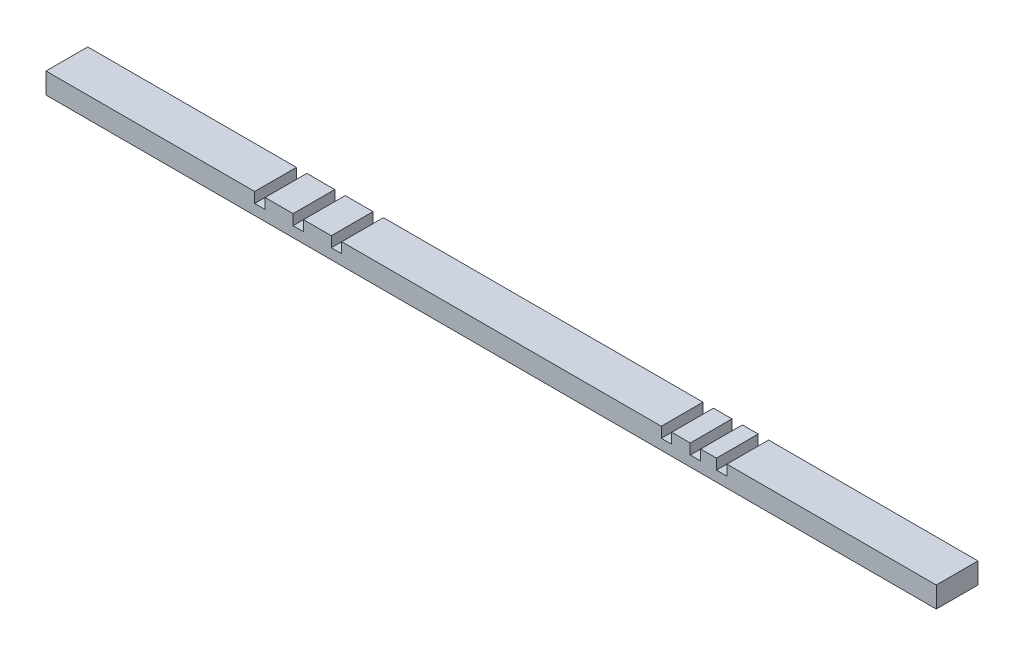
ISO-10303-21;
HEADER;
FILE_DESCRIPTION(('STEP AP214'),'2;1');
FILE_NAME('part.step','',(''),(''),'','','');
FILE_SCHEMA(('AUTOMOTIVE_DESIGN { 1 0 10303 214 1 1 1 1 }'));
ENDSEC;
DATA;
#1=APPLICATION_CONTEXT('core data for automotive mechanical design processes');
#2=APPLICATION_PROTOCOL_DEFINITION('international standard','automotive_design',2000,#1);
#3=PRODUCT_CONTEXT('',#1,'mechanical');
#4=PRODUCT('Part','Part','',(#3));
#5=PRODUCT_RELATED_PRODUCT_CATEGORY('part','',(#4));
#6=PRODUCT_DEFINITION_FORMATION('','',#4);
#7=PRODUCT_DEFINITION_CONTEXT('part definition',#1,'design');
#8=PRODUCT_DEFINITION('design','',#6,#7);
#9=PRODUCT_DEFINITION_SHAPE('','',#8);
#10=(LENGTH_UNIT() NAMED_UNIT(*) SI_UNIT(.MILLI.,.METRE.));
#11=(NAMED_UNIT(*) PLANE_ANGLE_UNIT() SI_UNIT($,.RADIAN.));
#12=(NAMED_UNIT(*) SI_UNIT($,.STERADIAN.) SOLID_ANGLE_UNIT());
#13=UNCERTAINTY_MEASURE_WITH_UNIT(LENGTH_MEASURE(1.E-05),#10,'distance_accuracy_value','');
#14=(GEOMETRIC_REPRESENTATION_CONTEXT(3) GLOBAL_UNCERTAINTY_ASSIGNED_CONTEXT((#13)) GLOBAL_UNIT_ASSIGNED_CONTEXT((#10,
#11,#12)) REPRESENTATION_CONTEXT('',''));
#15=CARTESIAN_POINT('',(0.,0.,0.));
#16=DIRECTION('',(0.,0.,1.));
#17=DIRECTION('',(1.,0.,0.));
#18=AXIS2_PLACEMENT_3D('',#15,#16,#17);
#19=CARTESIAN_POINT('',(0.,19.05,0.));
#20=DIRECTION('',(0.,1.,0.));
#21=DIRECTION('',(0.,0.,1.));
#22=AXIS2_PLACEMENT_3D('',#19,#20,#21);
#23=PLANE('',#22);
#24=DIRECTION('',(0.,0.,-1.));
#25=VECTOR('',#24,1.);
#26=CARTESIAN_POINT('',(621.649258871039,19.05,19.05));
#27=LINE('',#26,#25);
#28=CARTESIAN_POINT('',(621.649258871039,19.05,38.1));
#29=VERTEX_POINT('',#28);
#30=CARTESIAN_POINT('',(621.649258871039,19.05,0.));
#31=VERTEX_POINT('',#30);
#32=EDGE_CURVE('E342',#29,#31,#27,.T.);
#33=ORIENTED_EDGE('',*,*,#32,.F.);
#34=DIRECTION('',(1.,0.,0.));
#35=VECTOR('',#34,1.);
#36=CARTESIAN_POINT('',(0.,19.05,38.1));
#37=LINE('',#36,#35);
#38=CARTESIAN_POINT('',(812.8,19.05,38.1));
#39=VERTEX_POINT('',#38);
#40=EDGE_CURVE('E379',#29,#39,#37,.T.);
#41=ORIENTED_EDGE('',*,*,#40,.T.);
#42=DIRECTION('',(0.,0.,-1.));
#43=VECTOR('',#42,1.);
#44=CARTESIAN_POINT('',(812.8,19.05,0.));
#45=LINE('',#44,#43);
#46=CARTESIAN_POINT('',(812.8,19.05,0.));
#47=VERTEX_POINT('',#46);
#48=EDGE_CURVE('E384',#39,#47,#45,.T.);
#49=ORIENTED_EDGE('',*,*,#48,.T.);
#50=DIRECTION('',(-1.,0.,0.));
#51=VECTOR('',#50,1.);
#52=CARTESIAN_POINT('',(0.,19.05,0.));
#53=LINE('',#52,#51);
#54=EDGE_CURVE('E386',#47,#31,#53,.T.);
#55=ORIENTED_EDGE('',*,*,#54,.T.);
#56=EDGE_LOOP('',(#33,#41,#49,#55));
#57=FACE_BOUND('',#56,.T.);
#58=ADVANCED_FACE('F39',(#57),#23,.T.);
#59=DIRECTION('',(0.,0.,1.));
#60=VECTOR('',#59,1.);
#61=CARTESIAN_POINT('',(225.540462399528,19.05,19.05));
#62=LINE('',#61,#60);
#63=CARTESIAN_POINT('',(225.540462399528,19.05,0.));
#64=VERTEX_POINT('',#63);
#65=CARTESIAN_POINT('',(225.540462399528,19.05,38.1));
#66=VERTEX_POINT('',#65);
#67=EDGE_CURVE('E264',#64,#66,#62,.T.);
#68=ORIENTED_EDGE('',*,*,#67,.F.);
#69=CARTESIAN_POINT('',(200.025,19.05,0.));
#70=VERTEX_POINT('',#69);
#71=EDGE_CURVE('E428',#64,#70,#53,.T.);
#72=ORIENTED_EDGE('',*,*,#71,.T.);
#73=DIRECTION('',(0.,0.,-1.));
#74=VECTOR('',#73,1.);
#75=CARTESIAN_POINT('',(200.025,19.05,19.05));
#76=LINE('',#75,#74);
#77=CARTESIAN_POINT('',(200.025,19.05,38.1));
#78=VERTEX_POINT('',#77);
#79=EDGE_CURVE('E343',#78,#70,#76,.T.);
#80=ORIENTED_EDGE('',*,*,#79,.F.);
#81=EDGE_CURVE('E387',#78,#66,#37,.T.);
#82=ORIENTED_EDGE('',*,*,#81,.T.);
#83=EDGE_LOOP('',(#68,#72,#80,#82));
#84=FACE_BOUND('',#83,.T.);
#85=ADVANCED_FACE('F479',(#84),#23,.T.);
#86=DIRECTION('',(0.,0.,1.));
#87=VECTOR('',#86,1.);
#88=CARTESIAN_POINT('',(190.5,19.05,19.05));
#89=LINE('',#88,#87);
#90=CARTESIAN_POINT('',(190.5,19.05,0.));
#91=VERTEX_POINT('',#90);
#92=CARTESIAN_POINT('',(190.5,19.05,38.1));
#93=VERTEX_POINT('',#92);
#94=EDGE_CURVE('E336',#91,#93,#89,.T.);
#95=ORIENTED_EDGE('',*,*,#94,.F.);
#96=CARTESIAN_POINT('',(0.,19.05,0.));
#97=VERTEX_POINT('',#96);
#98=EDGE_CURVE('E389',#91,#97,#53,.T.);
#99=ORIENTED_EDGE('',*,*,#98,.T.);
#100=DIRECTION('',(0.,0.,1.));
#101=VECTOR('',#100,1.);
#102=CARTESIAN_POINT('',(0.,19.05,0.));
#103=LINE('',#102,#101);
#104=CARTESIAN_POINT('',(0.,19.05,38.1));
#105=VERTEX_POINT('',#104);
#106=EDGE_CURVE('E380',#97,#105,#103,.T.);
#107=ORIENTED_EDGE('',*,*,#106,.T.);
#108=EDGE_CURVE('E385',#105,#93,#37,.T.);
#109=ORIENTED_EDGE('',*,*,#108,.T.);
#110=EDGE_LOOP('',(#95,#99,#107,#109));
#111=FACE_BOUND('',#110,.T.);
#112=ADVANCED_FACE('F426',(#111),#23,.T.);
#113=DIRECTION('',(0.,0.,1.));
#114=VECTOR('',#113,1.);
#115=CARTESIAN_POINT('',(612.124258871039,19.05,19.05));
#116=LINE('',#115,#114);
#117=CARTESIAN_POINT('',(612.124258871039,19.05,0.));
#118=VERTEX_POINT('',#117);
#119=CARTESIAN_POINT('',(612.124258871039,19.05,38.1));
#120=VERTEX_POINT('',#119);
#121=EDGE_CURVE('E460',#118,#120,#116,.T.);
#122=ORIENTED_EDGE('',*,*,#121,.F.);
#123=CARTESIAN_POINT('',(597.713074559665,19.05,0.));
#124=VERTEX_POINT('',#123);
#125=EDGE_CURVE('E250',#118,#124,#53,.T.);
#126=ORIENTED_EDGE('',*,*,#125,.T.);
#127=DIRECTION('',(0.,0.,-1.));
#128=VECTOR('',#127,1.);
#129=CARTESIAN_POINT('',(597.713074559665,19.05,19.05));
#130=LINE('',#129,#128);
#131=CARTESIAN_POINT('',(597.713074559665,19.05,38.1));
#132=VERTEX_POINT('',#131);
#133=EDGE_CURVE('E339',#132,#124,#130,.T.);
#134=ORIENTED_EDGE('',*,*,#133,.F.);
#135=EDGE_CURVE('E456',#132,#120,#37,.T.);
#136=ORIENTED_EDGE('',*,*,#135,.T.);
#137=EDGE_LOOP('',(#122,#126,#134,#136));
#138=FACE_BOUND('',#137,.T.);
#139=ADVANCED_FACE('F452',(#138),#23,.T.);
#140=DIRECTION('',(0.,0.,1.));
#141=VECTOR('',#140,1.);
#142=CARTESIAN_POINT('',(588.188074559665,19.05,19.05));
#143=LINE('',#142,#141);
#144=CARTESIAN_POINT('',(588.188074559665,19.05,0.));
#145=VERTEX_POINT('',#144);
#146=CARTESIAN_POINT('',(588.188074559665,19.05,38.1));
#147=VERTEX_POINT('',#146);
#148=EDGE_CURVE('E365',#145,#147,#143,.T.);
#149=ORIENTED_EDGE('',*,*,#148,.F.);
#150=CARTESIAN_POINT('',(571.267451570485,19.05,0.));
#151=VERTEX_POINT('',#150);
#152=EDGE_CURVE('E445',#145,#151,#53,.T.);
#153=ORIENTED_EDGE('',*,*,#152,.T.);
#154=DIRECTION('',(0.,0.,-1.));
#155=VECTOR('',#154,1.);
#156=CARTESIAN_POINT('',(571.267451570485,19.05,19.05));
#157=LINE('',#156,#155);
#158=CARTESIAN_POINT('',(571.267451570485,19.05,38.1));
#159=VERTEX_POINT('',#158);
#160=EDGE_CURVE('E292',#159,#151,#157,.T.);
#161=ORIENTED_EDGE('',*,*,#160,.F.);
#162=EDGE_CURVE('E466',#159,#147,#37,.T.);
#163=ORIENTED_EDGE('',*,*,#162,.T.);
#164=EDGE_LOOP('',(#149,#153,#161,#163));
#165=FACE_BOUND('',#164,.T.);
#166=ADVANCED_FACE('F524',(#165),#23,.T.);
#167=DIRECTION('',(0.,0.,-1.));
#168=VECTOR('',#167,1.);
#169=CARTESIAN_POINT('',(235.065462399528,19.05,0.));
#170=LINE('',#169,#168);
#171=CARTESIAN_POINT('',(235.065462399528,19.05,38.1));
#172=VERTEX_POINT('',#171);
#173=CARTESIAN_POINT('',(235.065462399528,19.05,0.));
#174=VERTEX_POINT('',#173);
#175=EDGE_CURVE('E270',#172,#174,#170,.T.);
#176=ORIENTED_EDGE('',*,*,#175,.F.);
#177=CARTESIAN_POINT('',(260.466704478801,19.05,38.1));
#178=VERTEX_POINT('',#177);
#179=EDGE_CURVE('E471',#172,#178,#37,.T.);
#180=ORIENTED_EDGE('',*,*,#179,.T.);
#181=DIRECTION('',(0.,0.,1.));
#182=VECTOR('',#181,1.);
#183=CARTESIAN_POINT('',(260.466704478801,19.05,19.05));
#184=LINE('',#183,#182);
#185=CARTESIAN_POINT('',(260.466704478801,19.05,0.));
#186=VERTEX_POINT('',#185);
#187=EDGE_CURVE('E314',#186,#178,#184,.T.);
#188=ORIENTED_EDGE('',*,*,#187,.F.);
#189=EDGE_CURVE('E429',#186,#174,#53,.T.);
#190=ORIENTED_EDGE('',*,*,#189,.T.);
#191=EDGE_LOOP('',(#176,#180,#188,#190));
#192=FACE_BOUND('',#191,.T.);
#193=ADVANCED_FACE('F520',(#192),#23,.T.);
#194=CARTESIAN_POINT('',(0.,19.05,0.));
#195=DIRECTION('',(1.,0.,0.));
#196=DIRECTION('',(0.,0.,-1.));
#197=AXIS2_PLACEMENT_3D('',#194,#195,#196);
#198=PLANE('',#197);
#199=DIRECTION('',(0.,0.,1.));
#200=VECTOR('',#199,1.);
#201=CARTESIAN_POINT('',(0.,0.,0.));
#202=LINE('',#201,#200);
#203=CARTESIAN_POINT('',(0.,0.,0.));
#204=VERTEX_POINT('',#203);
#205=CARTESIAN_POINT('',(0.,0.,38.1));
#206=VERTEX_POINT('',#205);
#207=EDGE_CURVE('E394',#204,#206,#202,.T.);
#208=ORIENTED_EDGE('',*,*,#207,.T.);
#209=DIRECTION('',(0.,-1.,0.));
#210=VECTOR('',#209,1.);
#211=CARTESIAN_POINT('',(0.,19.05,38.1));
#212=LINE('',#211,#210);
#213=EDGE_CURVE('E11',#105,#206,#212,.T.);
#214=ORIENTED_EDGE('',*,*,#213,.F.);
#215=ORIENTED_EDGE('',*,*,#106,.F.);
#216=DIRECTION('',(0.,-1.,0.));
#217=VECTOR('',#216,1.);
#218=CARTESIAN_POINT('',(0.,19.05,0.));
#219=LINE('',#218,#217);
#220=EDGE_CURVE('E395',#97,#204,#219,.T.);
#221=ORIENTED_EDGE('',*,*,#220,.T.);
#222=EDGE_LOOP('',(#208,#214,#215,#221));
#223=FACE_BOUND('',#222,.T.);
#224=ADVANCED_FACE('F41',(#223),#198,.F.);
#225=CARTESIAN_POINT('',(0.,19.05,38.1));
#226=DIRECTION('',(0.,0.,-1.));
#227=DIRECTION('',(-1.,0.,0.));
#228=AXIS2_PLACEMENT_3D('',#225,#226,#227);
#229=PLANE('',#228);
#230=DIRECTION('',(1.,0.,0.));
#231=VECTOR('',#230,1.);
#232=CARTESIAN_POINT('',(612.124258871039,9.525,38.1));
#233=LINE('',#232,#231);
#234=CARTESIAN_POINT('',(612.124258871039,9.525,38.1));
#235=VERTEX_POINT('',#234);
#236=CARTESIAN_POINT('',(621.649258871039,9.525,38.1));
#237=VERTEX_POINT('',#236);
#238=EDGE_CURVE('E234',#235,#237,#233,.T.);
#239=ORIENTED_EDGE('',*,*,#238,.F.);
#240=DIRECTION('',(0.,1.,0.));
#241=VECTOR('',#240,1.);
#242=CARTESIAN_POINT('',(612.124258871039,9.525,38.1));
#243=LINE('',#242,#241);
#244=EDGE_CURVE('E233',#235,#120,#243,.T.);
#245=ORIENTED_EDGE('',*,*,#244,.T.);
#246=ORIENTED_EDGE('',*,*,#135,.F.);
#247=DIRECTION('',(0.,1.,0.));
#248=VECTOR('',#247,1.);
#249=CARTESIAN_POINT('',(597.713074559665,9.525,38.1));
#250=LINE('',#249,#248);
#251=CARTESIAN_POINT('',(597.713074559665,9.525,38.1));
#252=VERTEX_POINT('',#251);
#253=EDGE_CURVE('E294',#252,#132,#250,.T.);
#254=ORIENTED_EDGE('',*,*,#253,.F.);
#255=DIRECTION('',(1.,0.,0.));
#256=VECTOR('',#255,1.);
#257=CARTESIAN_POINT('',(597.713074559665,9.525,38.1));
#258=LINE('',#257,#256);
#259=CARTESIAN_POINT('',(588.188074559665,9.525,38.1));
#260=VERTEX_POINT('',#259);
#261=EDGE_CURVE('E360',#260,#252,#258,.T.);
#262=ORIENTED_EDGE('',*,*,#261,.F.);
#263=DIRECTION('',(0.,1.,0.));
#264=VECTOR('',#263,1.);
#265=CARTESIAN_POINT('',(588.188074559665,9.525,38.1));
#266=LINE('',#265,#264);
#267=EDGE_CURVE('E359',#260,#147,#266,.T.);
#268=ORIENTED_EDGE('',*,*,#267,.T.);
#269=ORIENTED_EDGE('',*,*,#162,.F.);
#270=DIRECTION('',(0.,1.,0.));
#271=VECTOR('',#270,1.);
#272=CARTESIAN_POINT('',(571.267451570485,9.525,38.1));
#273=LINE('',#272,#271);
#274=CARTESIAN_POINT('',(571.267451570485,9.525,38.1));
#275=VERTEX_POINT('',#274);
#276=EDGE_CURVE('E288',#275,#159,#273,.T.);
#277=ORIENTED_EDGE('',*,*,#276,.F.);
#278=DIRECTION('',(1.,0.,0.));
#279=VECTOR('',#278,1.);
#280=CARTESIAN_POINT('',(571.267451570485,9.525,38.1));
#281=LINE('',#280,#279);
#282=CARTESIAN_POINT('',(561.742451570485,9.525,38.1));
#283=VERTEX_POINT('',#282);
#284=EDGE_CURVE('E278',#283,#275,#281,.T.);
#285=ORIENTED_EDGE('',*,*,#284,.F.);
#286=DIRECTION('',(0.,1.,0.));
#287=VECTOR('',#286,1.);
#288=CARTESIAN_POINT('',(561.742451570485,9.525,38.1));
#289=LINE('',#288,#287);
#290=CARTESIAN_POINT('',(561.742451570485,19.05,38.1));
#291=VERTEX_POINT('',#290);
#292=EDGE_CURVE('E284',#283,#291,#289,.T.);
#293=ORIENTED_EDGE('',*,*,#292,.T.);
#294=CARTESIAN_POINT('',(269.991704478801,19.05,38.1));
#295=VERTEX_POINT('',#294);
#296=EDGE_CURVE('E469',#295,#291,#37,.T.);
#297=ORIENTED_EDGE('',*,*,#296,.F.);
#298=DIRECTION('',(0.,1.,0.));
#299=VECTOR('',#298,1.);
#300=CARTESIAN_POINT('',(269.991704478801,9.525,38.1));
#301=LINE('',#300,#299);
#302=CARTESIAN_POINT('',(269.991704478801,9.525,38.1));
#303=VERTEX_POINT('',#302);
#304=EDGE_CURVE('E306',#303,#295,#301,.T.);
#305=ORIENTED_EDGE('',*,*,#304,.F.);
#306=DIRECTION('',(1.,0.,0.));
#307=VECTOR('',#306,1.);
#308=CARTESIAN_POINT('',(269.991704478801,9.525,38.1));
#309=LINE('',#308,#307);
#310=CARTESIAN_POINT('',(260.466704478801,9.525,38.1));
#311=VERTEX_POINT('',#310);
#312=EDGE_CURVE('E325',#311,#303,#309,.T.);
#313=ORIENTED_EDGE('',*,*,#312,.F.);
#314=DIRECTION('',(0.,1.,0.));
#315=VECTOR('',#314,1.);
#316=CARTESIAN_POINT('',(260.466704478801,9.525,38.1));
#317=LINE('',#316,#315);
#318=EDGE_CURVE('E302',#311,#178,#317,.T.);
#319=ORIENTED_EDGE('',*,*,#318,.T.);
#320=ORIENTED_EDGE('',*,*,#179,.F.);
#321=DIRECTION('',(0.,1.,0.));
#322=VECTOR('',#321,1.);
#323=CARTESIAN_POINT('',(235.065462399528,9.525,38.1));
#324=LINE('',#323,#322);
#325=CARTESIAN_POINT('',(235.065462399528,9.525,38.1));
#326=VERTEX_POINT('',#325);
#327=EDGE_CURVE('E256',#326,#172,#324,.T.);
#328=ORIENTED_EDGE('',*,*,#327,.F.);
#329=DIRECTION('',(1.,0.,0.));
#330=VECTOR('',#329,1.);
#331=CARTESIAN_POINT('',(235.065462399528,9.525,38.1));
#332=LINE('',#331,#330);
#333=CARTESIAN_POINT('',(225.540462399528,9.525,38.1));
#334=VERTEX_POINT('',#333);
#335=EDGE_CURVE('E272',#334,#326,#332,.T.);
#336=ORIENTED_EDGE('',*,*,#335,.F.);
#337=DIRECTION('',(0.,1.,0.));
#338=VECTOR('',#337,1.);
#339=CARTESIAN_POINT('',(225.540462399528,9.525,38.1));
#340=LINE('',#339,#338);
#341=EDGE_CURVE('E255',#334,#66,#340,.T.);
#342=ORIENTED_EDGE('',*,*,#341,.T.);
#343=ORIENTED_EDGE('',*,*,#81,.F.);
#344=DIRECTION('',(0.,1.,0.));
#345=VECTOR('',#344,1.);
#346=CARTESIAN_POINT('',(200.025,9.525,38.1));
#347=LINE('',#346,#345);
#348=CARTESIAN_POINT('',(200.025,9.525,38.1));
#349=VERTEX_POINT('',#348);
#350=EDGE_CURVE('E332',#349,#78,#347,.T.);
#351=ORIENTED_EDGE('',*,*,#350,.F.);
#352=DIRECTION('',(1.,0.,0.));
#353=VECTOR('',#352,1.);
#354=CARTESIAN_POINT('',(200.025,9.525,38.1));
#355=LINE('',#354,#353);
#356=CARTESIAN_POINT('',(190.5,9.525,38.1));
#357=VERTEX_POINT('',#356);
#358=EDGE_CURVE('E348',#357,#349,#355,.T.);
#359=ORIENTED_EDGE('',*,*,#358,.F.);
#360=DIRECTION('',(0.,1.,0.));
#361=VECTOR('',#360,1.);
#362=CARTESIAN_POINT('',(190.5,9.525,38.1));
#363=LINE('',#362,#361);
#364=EDGE_CURVE('E330',#357,#93,#363,.T.);
#365=ORIENTED_EDGE('',*,*,#364,.T.);
#366=ORIENTED_EDGE('',*,*,#108,.F.);
#367=ORIENTED_EDGE('',*,*,#213,.T.);
#368=DIRECTION('',(1.,0.,0.));
#369=VECTOR('',#368,1.);
#370=CARTESIAN_POINT('',(0.,0.,38.1));
#371=LINE('',#370,#369);
#372=CARTESIAN_POINT('',(812.8,0.,38.1));
#373=VERTEX_POINT('',#372);
#374=EDGE_CURVE('E398',#206,#373,#371,.T.);
#375=ORIENTED_EDGE('',*,*,#374,.T.);
#376=DIRECTION('',(0.,-1.,0.));
#377=VECTOR('',#376,1.);
#378=CARTESIAN_POINT('',(812.8,19.05,38.1));
#379=LINE('',#378,#377);
#380=EDGE_CURVE('E50',#39,#373,#379,.T.);
#381=ORIENTED_EDGE('',*,*,#380,.F.);
#382=ORIENTED_EDGE('',*,*,#40,.F.);
#383=DIRECTION('',(0.,1.,0.));
#384=VECTOR('',#383,1.);
#385=CARTESIAN_POINT('',(621.649258871039,9.525,38.1));
#386=LINE('',#385,#384);
#387=EDGE_CURVE('E247',#237,#29,#386,.T.);
#388=ORIENTED_EDGE('',*,*,#387,.F.);
#389=EDGE_LOOP('',(#239,#245,#246,#254,#262,#268,#269,#277,#285,#293,#297,#305,#313,#319,#320,
#328,#336,#342,#343,#351,#359,#365,#366,#367,#375,#381,#382,#388));
#390=FACE_BOUND('',#389,.T.);
#391=ADVANCED_FACE('F470',(#390),#229,.F.);
#392=CARTESIAN_POINT('',(812.8,19.05,0.));
#393=DIRECTION('',(-1.,0.,0.));
#394=DIRECTION('',(0.,0.,1.));
#395=AXIS2_PLACEMENT_3D('',#392,#393,#394);
#396=PLANE('',#395);
#397=DIRECTION('',(0.,0.,-1.));
#398=VECTOR('',#397,1.);
#399=CARTESIAN_POINT('',(812.8,0.,0.));
#400=LINE('',#399,#398);
#401=CARTESIAN_POINT('',(812.8,0.,0.));
#402=VERTEX_POINT('',#401);
#403=EDGE_CURVE('E396',#373,#402,#400,.T.);
#404=ORIENTED_EDGE('',*,*,#403,.T.);
#405=DIRECTION('',(0.,-1.,0.));
#406=VECTOR('',#405,1.);
#407=CARTESIAN_POINT('',(812.8,19.05,0.));
#408=LINE('',#407,#406);
#409=EDGE_CURVE('E401',#47,#402,#408,.T.);
#410=ORIENTED_EDGE('',*,*,#409,.F.);
#411=ORIENTED_EDGE('',*,*,#48,.F.);
#412=ORIENTED_EDGE('',*,*,#380,.T.);
#413=EDGE_LOOP('',(#404,#410,#411,#412));
#414=FACE_BOUND('',#413,.T.);
#415=ADVANCED_FACE('F408',(#414),#396,.F.);
#416=CARTESIAN_POINT('',(0.,19.05,0.));
#417=DIRECTION('',(0.,0.,1.));
#418=DIRECTION('',(1.,0.,0.));
#419=AXIS2_PLACEMENT_3D('',#416,#417,#418);
#420=PLANE('',#419);
#421=DIRECTION('',(-1.,0.,0.));
#422=VECTOR('',#421,1.);
#423=CARTESIAN_POINT('',(621.649258871039,9.525,0.));
#424=LINE('',#423,#422);
#425=CARTESIAN_POINT('',(621.649258871039,9.525,0.));
#426=VERTEX_POINT('',#425);
#427=CARTESIAN_POINT('',(612.124258871039,9.525,0.));
#428=VERTEX_POINT('',#427);
#429=EDGE_CURVE('E237',#426,#428,#424,.T.);
#430=ORIENTED_EDGE('',*,*,#429,.F.);
#431=DIRECTION('',(0.,1.,0.));
#432=VECTOR('',#431,1.);
#433=CARTESIAN_POINT('',(621.649258871039,9.525,0.));
#434=LINE('',#433,#432);
#435=EDGE_CURVE('E53',#426,#31,#434,.T.);
#436=ORIENTED_EDGE('',*,*,#435,.T.);
#437=ORIENTED_EDGE('',*,*,#54,.F.);
#438=ORIENTED_EDGE('',*,*,#409,.T.);
#439=DIRECTION('',(-1.,0.,0.));
#440=VECTOR('',#439,1.);
#441=CARTESIAN_POINT('',(0.,0.,0.));
#442=LINE('',#441,#440);
#443=EDGE_CURVE('E381',#402,#204,#442,.T.);
#444=ORIENTED_EDGE('',*,*,#443,.T.);
#445=ORIENTED_EDGE('',*,*,#220,.F.);
#446=ORIENTED_EDGE('',*,*,#98,.F.);
#447=DIRECTION('',(0.,1.,0.));
#448=VECTOR('',#447,1.);
#449=CARTESIAN_POINT('',(190.5,9.525,0.));
#450=LINE('',#449,#448);
#451=CARTESIAN_POINT('',(190.5,9.525,0.));
#452=VERTEX_POINT('',#451);
#453=EDGE_CURVE('E337',#452,#91,#450,.T.);
#454=ORIENTED_EDGE('',*,*,#453,.F.);
#455=DIRECTION('',(-1.,0.,0.));
#456=VECTOR('',#455,1.);
#457=CARTESIAN_POINT('',(190.5,9.525,0.));
#458=LINE('',#457,#456);
#459=CARTESIAN_POINT('',(200.025,9.525,0.));
#460=VERTEX_POINT('',#459);
#461=EDGE_CURVE('E329',#460,#452,#458,.T.);
#462=ORIENTED_EDGE('',*,*,#461,.F.);
#463=DIRECTION('',(0.,1.,0.));
#464=VECTOR('',#463,1.);
#465=CARTESIAN_POINT('',(200.025,9.525,0.));
#466=LINE('',#465,#464);
#467=EDGE_CURVE('E334',#460,#70,#466,.T.);
#468=ORIENTED_EDGE('',*,*,#467,.T.);
#469=ORIENTED_EDGE('',*,*,#71,.F.);
#470=DIRECTION('',(0.,1.,0.));
#471=VECTOR('',#470,1.);
#472=CARTESIAN_POINT('',(225.540462399528,9.525,0.));
#473=LINE('',#472,#471);
#474=CARTESIAN_POINT('',(225.540462399528,9.525,0.));
#475=VERTEX_POINT('',#474);
#476=EDGE_CURVE('E263',#475,#64,#473,.T.);
#477=ORIENTED_EDGE('',*,*,#476,.F.);
#478=DIRECTION('',(-1.,0.,0.));
#479=VECTOR('',#478,1.);
#480=CARTESIAN_POINT('',(225.540462399528,9.525,0.));
#481=LINE('',#480,#479);
#482=CARTESIAN_POINT('',(235.065462399528,9.525,0.));
#483=VERTEX_POINT('',#482);
#484=EDGE_CURVE('E260',#483,#475,#481,.T.);
#485=ORIENTED_EDGE('',*,*,#484,.F.);
#486=DIRECTION('',(0.,1.,0.));
#487=VECTOR('',#486,1.);
#488=CARTESIAN_POINT('',(235.065462399528,9.525,0.));
#489=LINE('',#488,#487);
#490=EDGE_CURVE('E257',#483,#174,#489,.T.);
#491=ORIENTED_EDGE('',*,*,#490,.T.);
#492=ORIENTED_EDGE('',*,*,#189,.F.);
#493=DIRECTION('',(0.,1.,0.));
#494=VECTOR('',#493,1.);
#495=CARTESIAN_POINT('',(260.466704478801,9.525,0.));
#496=LINE('',#495,#494);
#497=CARTESIAN_POINT('',(260.466704478801,9.525,0.));
#498=VERTEX_POINT('',#497);
#499=EDGE_CURVE('E269',#498,#186,#496,.T.);
#500=ORIENTED_EDGE('',*,*,#499,.F.);
#501=DIRECTION('',(-1.,0.,0.));
#502=VECTOR('',#501,1.);
#503=CARTESIAN_POINT('',(260.466704478801,9.525,0.));
#504=LINE('',#503,#502);
#505=CARTESIAN_POINT('',(269.991704478801,9.525,0.));
#506=VERTEX_POINT('',#505);
#507=EDGE_CURVE('E307',#506,#498,#504,.T.);
#508=ORIENTED_EDGE('',*,*,#507,.F.);
#509=DIRECTION('',(0.,1.,0.));
#510=VECTOR('',#509,1.);
#511=CARTESIAN_POINT('',(269.991704478801,9.525,0.));
#512=LINE('',#511,#510);
#513=CARTESIAN_POINT('',(269.991704478801,19.05,0.));
#514=VERTEX_POINT('',#513);
#515=EDGE_CURVE('E309',#506,#514,#512,.T.);
#516=ORIENTED_EDGE('',*,*,#515,.T.);
#517=CARTESIAN_POINT('',(561.742451570485,19.05,0.));
#518=VERTEX_POINT('',#517);
#519=EDGE_CURVE('E436',#518,#514,#53,.T.);
#520=ORIENTED_EDGE('',*,*,#519,.F.);
#521=DIRECTION('',(0.,1.,0.));
#522=VECTOR('',#521,1.);
#523=CARTESIAN_POINT('',(561.742451570485,9.525,0.));
#524=LINE('',#523,#522);
#525=CARTESIAN_POINT('',(561.742451570485,9.525,0.));
#526=VERTEX_POINT('',#525);
#527=EDGE_CURVE('E282',#526,#518,#524,.T.);
#528=ORIENTED_EDGE('',*,*,#527,.F.);
#529=DIRECTION('',(-1.,0.,0.));
#530=VECTOR('',#529,1.);
#531=CARTESIAN_POINT('',(571.267451570485,9.525,0.));
#532=LINE('',#531,#530);
#533=CARTESIAN_POINT('',(571.267451570485,9.525,0.));
#534=VERTEX_POINT('',#533);
#535=EDGE_CURVE('E296',#534,#526,#532,.T.);
#536=ORIENTED_EDGE('',*,*,#535,.F.);
#537=DIRECTION('',(0.,1.,0.));
#538=VECTOR('',#537,1.);
#539=CARTESIAN_POINT('',(571.267451570485,9.525,0.));
#540=LINE('',#539,#538);
#541=EDGE_CURVE('E280',#534,#151,#540,.T.);
#542=ORIENTED_EDGE('',*,*,#541,.T.);
#543=ORIENTED_EDGE('',*,*,#152,.F.);
#544=DIRECTION('',(0.,1.,0.));
#545=VECTOR('',#544,1.);
#546=CARTESIAN_POINT('',(588.188074559665,9.525,0.));
#547=LINE('',#546,#545);
#548=CARTESIAN_POINT('',(588.188074559665,9.525,0.));
#549=VERTEX_POINT('',#548);
#550=EDGE_CURVE('E356',#549,#145,#547,.T.);
#551=ORIENTED_EDGE('',*,*,#550,.F.);
#552=DIRECTION('',(-1.,0.,0.));
#553=VECTOR('',#552,1.);
#554=CARTESIAN_POINT('',(597.713074559665,9.525,0.));
#555=LINE('',#554,#553);
#556=CARTESIAN_POINT('',(597.713074559665,9.525,0.));
#557=VERTEX_POINT('',#556);
#558=EDGE_CURVE('E375',#557,#549,#555,.T.);
#559=ORIENTED_EDGE('',*,*,#558,.F.);
#560=DIRECTION('',(0.,1.,0.));
#561=VECTOR('',#560,1.);
#562=CARTESIAN_POINT('',(597.713074559665,9.525,0.));
#563=LINE('',#562,#561);
#564=EDGE_CURVE('E353',#557,#124,#563,.T.);
#565=ORIENTED_EDGE('',*,*,#564,.T.);
#566=ORIENTED_EDGE('',*,*,#125,.F.);
#567=DIRECTION('',(0.,1.,0.));
#568=VECTOR('',#567,1.);
#569=CARTESIAN_POINT('',(612.124258871039,9.525,0.));
#570=LINE('',#569,#568);
#571=EDGE_CURVE('E229',#428,#118,#570,.T.);
#572=ORIENTED_EDGE('',*,*,#571,.F.);
#573=EDGE_LOOP('',(#430,#436,#437,#438,#444,#445,#446,#454,#462,#468,#469,#477,#485,#491,#492,
#500,#508,#516,#520,#528,#536,#542,#543,#551,#559,#565,#566,#572));
#574=FACE_BOUND('',#573,.T.);
#575=ADVANCED_FACE('F241',(#574),#420,.F.);
#576=DIRECTION('',(0.,0.,1.));
#577=VECTOR('',#576,1.);
#578=CARTESIAN_POINT('',(561.742451570485,19.05,19.05));
#579=LINE('',#578,#577);
#580=EDGE_CURVE('E287',#518,#291,#579,.T.);
#581=ORIENTED_EDGE('',*,*,#580,.F.);
#582=ORIENTED_EDGE('',*,*,#519,.T.);
#583=DIRECTION('',(0.,0.,-1.));
#584=VECTOR('',#583,1.);
#585=CARTESIAN_POINT('',(269.991704478801,19.05,0.));
#586=LINE('',#585,#584);
#587=EDGE_CURVE('E286',#295,#514,#586,.T.);
#588=ORIENTED_EDGE('',*,*,#587,.F.);
#589=ORIENTED_EDGE('',*,*,#296,.T.);
#590=EDGE_LOOP('',(#581,#582,#588,#589));
#591=FACE_BOUND('',#590,.T.);
#592=ADVANCED_FACE('F509',(#591),#23,.T.);
#593=CARTESIAN_POINT('',(0.,0.,0.));
#594=DIRECTION('',(0.,1.,0.));
#595=DIRECTION('',(0.,0.,1.));
#596=AXIS2_PLACEMENT_3D('',#593,#594,#595);
#597=PLANE('',#596);
#598=ORIENTED_EDGE('',*,*,#207,.F.);
#599=ORIENTED_EDGE('',*,*,#443,.F.);
#600=ORIENTED_EDGE('',*,*,#403,.F.);
#601=ORIENTED_EDGE('',*,*,#374,.F.);
#602=EDGE_LOOP('',(#598,#599,#600,#601));
#603=FACE_BOUND('',#602,.T.);
#604=ADVANCED_FACE('F417',(#603),#597,.F.);
#605=CARTESIAN_POINT('',(260.466704478801,9.525,19.05));
#606=DIRECTION('',(-1.,0.,0.));
#607=DIRECTION('',(0.,0.,1.));
#608=AXIS2_PLACEMENT_3D('',#605,#606,#607);
#609=PLANE('',#608);
#610=ORIENTED_EDGE('',*,*,#187,.T.);
#611=ORIENTED_EDGE('',*,*,#318,.F.);
#612=DIRECTION('',(0.,0.,1.));
#613=VECTOR('',#612,1.);
#614=CARTESIAN_POINT('',(260.466704478801,9.525,38.1));
#615=LINE('',#614,#613);
#616=EDGE_CURVE('E316',#498,#311,#615,.T.);
#617=ORIENTED_EDGE('',*,*,#616,.F.);
#618=ORIENTED_EDGE('',*,*,#499,.T.);
#619=EDGE_LOOP('',(#610,#611,#617,#618));
#620=FACE_BOUND('',#619,.T.);
#621=ADVANCED_FACE('F525',(#620),#609,.F.);
#622=CARTESIAN_POINT('',(269.991704478801,9.525,0.));
#623=DIRECTION('',(1.,0.,0.));
#624=DIRECTION('',(0.,0.,-1.));
#625=AXIS2_PLACEMENT_3D('',#622,#623,#624);
#626=PLANE('',#625);
#627=ORIENTED_EDGE('',*,*,#587,.T.);
#628=ORIENTED_EDGE('',*,*,#515,.F.);
#629=DIRECTION('',(0.,0.,-1.));
#630=VECTOR('',#629,1.);
#631=CARTESIAN_POINT('',(269.991704478801,9.525,0.));
#632=LINE('',#631,#630);
#633=EDGE_CURVE('E319',#303,#506,#632,.T.);
#634=ORIENTED_EDGE('',*,*,#633,.F.);
#635=ORIENTED_EDGE('',*,*,#304,.T.);
#636=EDGE_LOOP('',(#627,#628,#634,#635));
#637=FACE_BOUND('',#636,.T.);
#638=ADVANCED_FACE('F564',(#637),#626,.F.);
#639=CARTESIAN_POINT('',(0.,9.525,0.));
#640=DIRECTION('',(0.,-1.,0.));
#641=DIRECTION('',(0.,0.,-1.));
#642=AXIS2_PLACEMENT_3D('',#639,#640,#641);
#643=PLANE('',#642);
#644=ORIENTED_EDGE('',*,*,#616,.T.);
#645=ORIENTED_EDGE('',*,*,#312,.T.);
#646=ORIENTED_EDGE('',*,*,#633,.T.);
#647=ORIENTED_EDGE('',*,*,#507,.T.);
#648=EDGE_LOOP('',(#644,#645,#646,#647));
#649=FACE_BOUND('',#648,.T.);
#650=ADVANCED_FACE('F536',(#649),#643,.F.);
#651=CARTESIAN_POINT('',(561.742451570485,9.525,19.05));
#652=DIRECTION('',(-1.,0.,0.));
#653=DIRECTION('',(0.,0.,1.));
#654=AXIS2_PLACEMENT_3D('',#651,#652,#653);
#655=PLANE('',#654);
#656=ORIENTED_EDGE('',*,*,#580,.T.);
#657=ORIENTED_EDGE('',*,*,#292,.F.);
#658=DIRECTION('',(0.,0.,1.));
#659=VECTOR('',#658,1.);
#660=CARTESIAN_POINT('',(561.742451570485,9.525,19.05));
#661=LINE('',#660,#659);
#662=EDGE_CURVE('E300',#526,#283,#661,.T.);
#663=ORIENTED_EDGE('',*,*,#662,.F.);
#664=ORIENTED_EDGE('',*,*,#527,.T.);
#665=EDGE_LOOP('',(#656,#657,#663,#664));
#666=FACE_BOUND('',#665,.T.);
#667=ADVANCED_FACE('F557',(#666),#655,.F.);
#668=CARTESIAN_POINT('',(571.267451570485,9.525,19.05));
#669=DIRECTION('',(1.,0.,0.));
#670=DIRECTION('',(0.,0.,-1.));
#671=AXIS2_PLACEMENT_3D('',#668,#669,#670);
#672=PLANE('',#671);
#673=ORIENTED_EDGE('',*,*,#160,.T.);
#674=ORIENTED_EDGE('',*,*,#541,.F.);
#675=DIRECTION('',(0.,0.,-1.));
#676=VECTOR('',#675,1.);
#677=CARTESIAN_POINT('',(571.267451570485,9.525,19.05));
#678=LINE('',#677,#676);
#679=EDGE_CURVE('E295',#275,#534,#678,.T.);
#680=ORIENTED_EDGE('',*,*,#679,.F.);
#681=ORIENTED_EDGE('',*,*,#276,.T.);
#682=EDGE_LOOP('',(#673,#674,#680,#681));
#683=FACE_BOUND('',#682,.T.);
#684=ADVANCED_FACE('F555',(#683),#672,.F.);
#685=CARTESIAN_POINT('',(0.,9.525,0.));
#686=DIRECTION('',(0.,-1.,0.));
#687=DIRECTION('',(0.,0.,-1.));
#688=AXIS2_PLACEMENT_3D('',#685,#686,#687);
#689=PLANE('',#688);
#690=ORIENTED_EDGE('',*,*,#679,.T.);
#691=ORIENTED_EDGE('',*,*,#535,.T.);
#692=ORIENTED_EDGE('',*,*,#662,.T.);
#693=ORIENTED_EDGE('',*,*,#284,.T.);
#694=EDGE_LOOP('',(#690,#691,#692,#693));
#695=FACE_BOUND('',#694,.T.);
#696=ADVANCED_FACE('F553',(#695),#689,.F.);
#697=CARTESIAN_POINT('',(588.188074559665,9.525,19.05));
#698=DIRECTION('',(-1.,0.,0.));
#699=DIRECTION('',(0.,0.,1.));
#700=AXIS2_PLACEMENT_3D('',#697,#698,#699);
#701=PLANE('',#700);
#702=ORIENTED_EDGE('',*,*,#148,.T.);
#703=ORIENTED_EDGE('',*,*,#267,.F.);
#704=DIRECTION('',(0.,0.,1.));
#705=VECTOR('',#704,1.);
#706=CARTESIAN_POINT('',(588.188074559665,9.525,19.05));
#707=LINE('',#706,#705);
#708=EDGE_CURVE('E367',#549,#260,#707,.T.);
#709=ORIENTED_EDGE('',*,*,#708,.F.);
#710=ORIENTED_EDGE('',*,*,#550,.T.);
#711=EDGE_LOOP('',(#702,#703,#709,#710));
#712=FACE_BOUND('',#711,.T.);
#713=ADVANCED_FACE('F561',(#712),#701,.F.);
#714=CARTESIAN_POINT('',(597.713074559665,9.525,19.05));
#715=DIRECTION('',(1.,0.,0.));
#716=DIRECTION('',(0.,0.,-1.));
#717=AXIS2_PLACEMENT_3D('',#714,#715,#716);
#718=PLANE('',#717);
#719=ORIENTED_EDGE('',*,*,#133,.T.);
#720=ORIENTED_EDGE('',*,*,#564,.F.);
#721=DIRECTION('',(0.,0.,-1.));
#722=VECTOR('',#721,1.);
#723=CARTESIAN_POINT('',(597.713074559665,9.525,19.05));
#724=LINE('',#723,#722);
#725=EDGE_CURVE('E368',#252,#557,#724,.T.);
#726=ORIENTED_EDGE('',*,*,#725,.F.);
#727=ORIENTED_EDGE('',*,*,#253,.T.);
#728=EDGE_LOOP('',(#719,#720,#726,#727));
#729=FACE_BOUND('',#728,.T.);
#730=ADVANCED_FACE('F501',(#729),#718,.F.);
#731=CARTESIAN_POINT('',(0.,9.525,0.));
#732=DIRECTION('',(0.,-1.,0.));
#733=DIRECTION('',(0.,0.,-1.));
#734=AXIS2_PLACEMENT_3D('',#731,#732,#733);
#735=PLANE('',#734);
#736=ORIENTED_EDGE('',*,*,#725,.T.);
#737=ORIENTED_EDGE('',*,*,#558,.T.);
#738=ORIENTED_EDGE('',*,*,#708,.T.);
#739=ORIENTED_EDGE('',*,*,#261,.T.);
#740=EDGE_LOOP('',(#736,#737,#738,#739));
#741=FACE_BOUND('',#740,.T.);
#742=ADVANCED_FACE('F500',(#741),#735,.F.);
#743=CARTESIAN_POINT('',(190.5,9.525,19.05));
#744=DIRECTION('',(-1.,0.,0.));
#745=DIRECTION('',(0.,0.,1.));
#746=AXIS2_PLACEMENT_3D('',#743,#744,#745);
#747=PLANE('',#746);
#748=ORIENTED_EDGE('',*,*,#94,.T.);
#749=ORIENTED_EDGE('',*,*,#364,.F.);
#750=DIRECTION('',(0.,0.,1.));
#751=VECTOR('',#750,1.);
#752=CARTESIAN_POINT('',(190.5,9.525,38.1));
#753=LINE('',#752,#751);
#754=EDGE_CURVE('E345',#452,#357,#753,.T.);
#755=ORIENTED_EDGE('',*,*,#754,.F.);
#756=ORIENTED_EDGE('',*,*,#453,.T.);
#757=EDGE_LOOP('',(#748,#749,#755,#756));
#758=FACE_BOUND('',#757,.T.);
#759=ADVANCED_FACE('F494',(#758),#747,.F.);
#760=CARTESIAN_POINT('',(200.025,9.525,19.05));
#761=DIRECTION('',(1.,0.,0.));
#762=DIRECTION('',(0.,0.,-1.));
#763=AXIS2_PLACEMENT_3D('',#760,#761,#762);
#764=PLANE('',#763);
#765=ORIENTED_EDGE('',*,*,#79,.T.);
#766=ORIENTED_EDGE('',*,*,#467,.F.);
#767=DIRECTION('',(0.,0.,-1.));
#768=VECTOR('',#767,1.);
#769=CARTESIAN_POINT('',(200.025,9.525,19.05));
#770=LINE('',#769,#768);
#771=EDGE_CURVE('E350',#349,#460,#770,.T.);
#772=ORIENTED_EDGE('',*,*,#771,.F.);
#773=ORIENTED_EDGE('',*,*,#350,.T.);
#774=EDGE_LOOP('',(#765,#766,#772,#773));
#775=FACE_BOUND('',#774,.T.);
#776=ADVANCED_FACE('F491',(#775),#764,.F.);
#777=CARTESIAN_POINT('',(0.,9.525,0.));
#778=DIRECTION('',(0.,-1.,0.));
#779=DIRECTION('',(0.,0.,-1.));
#780=AXIS2_PLACEMENT_3D('',#777,#778,#779);
#781=PLANE('',#780);
#782=ORIENTED_EDGE('',*,*,#754,.T.);
#783=ORIENTED_EDGE('',*,*,#358,.T.);
#784=ORIENTED_EDGE('',*,*,#771,.T.);
#785=ORIENTED_EDGE('',*,*,#461,.T.);
#786=EDGE_LOOP('',(#782,#783,#784,#785));
#787=FACE_BOUND('',#786,.T.);
#788=ADVANCED_FACE('F492',(#787),#781,.F.);
#789=CARTESIAN_POINT('',(225.540462399528,9.525,19.05));
#790=DIRECTION('',(-1.,0.,0.));
#791=DIRECTION('',(0.,0.,1.));
#792=AXIS2_PLACEMENT_3D('',#789,#790,#791);
#793=PLANE('',#792);
#794=ORIENTED_EDGE('',*,*,#67,.T.);
#795=ORIENTED_EDGE('',*,*,#341,.F.);
#796=DIRECTION('',(0.,0.,1.));
#797=VECTOR('',#796,1.);
#798=CARTESIAN_POINT('',(225.540462399528,9.525,38.1));
#799=LINE('',#798,#797);
#800=EDGE_CURVE('E268',#475,#334,#799,.T.);
#801=ORIENTED_EDGE('',*,*,#800,.F.);
#802=ORIENTED_EDGE('',*,*,#476,.T.);
#803=EDGE_LOOP('',(#794,#795,#801,#802));
#804=FACE_BOUND('',#803,.T.);
#805=ADVANCED_FACE('F484',(#804),#793,.F.);
#806=CARTESIAN_POINT('',(235.065462399528,9.525,0.));
#807=DIRECTION('',(1.,0.,0.));
#808=DIRECTION('',(0.,0.,-1.));
#809=AXIS2_PLACEMENT_3D('',#806,#807,#808);
#810=PLANE('',#809);
#811=ORIENTED_EDGE('',*,*,#175,.T.);
#812=ORIENTED_EDGE('',*,*,#490,.F.);
#813=DIRECTION('',(0.,0.,-1.));
#814=VECTOR('',#813,1.);
#815=CARTESIAN_POINT('',(235.065462399528,9.525,0.));
#816=LINE('',#815,#814);
#817=EDGE_CURVE('E65',#326,#483,#816,.T.);
#818=ORIENTED_EDGE('',*,*,#817,.F.);
#819=ORIENTED_EDGE('',*,*,#327,.T.);
#820=EDGE_LOOP('',(#811,#812,#818,#819));
#821=FACE_BOUND('',#820,.T.);
#822=ADVANCED_FACE('F539',(#821),#810,.F.);
#823=CARTESIAN_POINT('',(0.,9.525,0.));
#824=DIRECTION('',(0.,-1.,0.));
#825=DIRECTION('',(0.,0.,-1.));
#826=AXIS2_PLACEMENT_3D('',#823,#824,#825);
#827=PLANE('',#826);
#828=ORIENTED_EDGE('',*,*,#800,.T.);
#829=ORIENTED_EDGE('',*,*,#335,.T.);
#830=ORIENTED_EDGE('',*,*,#817,.T.);
#831=ORIENTED_EDGE('',*,*,#484,.T.);
#832=EDGE_LOOP('',(#828,#829,#830,#831));
#833=FACE_BOUND('',#832,.T.);
#834=ADVANCED_FACE('F486',(#833),#827,.F.);
#835=CARTESIAN_POINT('',(612.124258871039,9.525,19.05));
#836=DIRECTION('',(-1.,0.,0.));
#837=DIRECTION('',(0.,0.,1.));
#838=AXIS2_PLACEMENT_3D('',#835,#836,#837);
#839=PLANE('',#838);
#840=ORIENTED_EDGE('',*,*,#121,.T.);
#841=ORIENTED_EDGE('',*,*,#244,.F.);
#842=DIRECTION('',(0.,0.,1.));
#843=VECTOR('',#842,1.);
#844=CARTESIAN_POINT('',(612.124258871039,9.525,19.05));
#845=LINE('',#844,#843);
#846=EDGE_CURVE('E221',#428,#235,#845,.T.);
#847=ORIENTED_EDGE('',*,*,#846,.F.);
#848=ORIENTED_EDGE('',*,*,#571,.T.);
#849=EDGE_LOOP('',(#840,#841,#847,#848));
#850=FACE_BOUND('',#849,.T.);
#851=ADVANCED_FACE('F227',(#850),#839,.F.);
#852=CARTESIAN_POINT('',(621.649258871039,9.525,19.05));
#853=DIRECTION('',(1.,0.,0.));
#854=DIRECTION('',(0.,0.,-1.));
#855=AXIS2_PLACEMENT_3D('',#852,#853,#854);
#856=PLANE('',#855);
#857=ORIENTED_EDGE('',*,*,#32,.T.);
#858=ORIENTED_EDGE('',*,*,#435,.F.);
#859=DIRECTION('',(0.,0.,-1.));
#860=VECTOR('',#859,1.);
#861=CARTESIAN_POINT('',(621.649258871039,9.525,19.05));
#862=LINE('',#861,#860);
#863=EDGE_CURVE('E238',#237,#426,#862,.T.);
#864=ORIENTED_EDGE('',*,*,#863,.F.);
#865=ORIENTED_EDGE('',*,*,#387,.T.);
#866=EDGE_LOOP('',(#857,#858,#864,#865));
#867=FACE_BOUND('',#866,.T.);
#868=ADVANCED_FACE('F463',(#867),#856,.F.);
#869=CARTESIAN_POINT('',(0.,9.525,0.));
#870=DIRECTION('',(0.,1.,0.));
#871=DIRECTION('',(0.,0.,1.));
#872=AXIS2_PLACEMENT_3D('',#869,#870,#871);
#873=PLANE('',#872);
#874=ORIENTED_EDGE('',*,*,#863,.T.);
#875=ORIENTED_EDGE('',*,*,#429,.T.);
#876=ORIENTED_EDGE('',*,*,#846,.T.);
#877=ORIENTED_EDGE('',*,*,#238,.T.);
#878=EDGE_LOOP('',(#874,#875,#876,#877));
#879=FACE_BOUND('',#878,.T.);
#880=ADVANCED_FACE('F239',(#879),#873,.T.);
#881=CLOSED_SHELL('',(#58,#85,#112,#139,#166,#193,#224,#391,#415,#575,#592,#604,#621,#638,#650,
#667,#684,#696,#713,#730,#742,#759,#776,#788,#805,#822,#834,#851,#868,#880));
#882=MANIFOLD_SOLID_BREP('B2',#881);
#883=ADVANCED_BREP_SHAPE_REPRESENTATION('',(#18,#882),#14);
#884=SHAPE_DEFINITION_REPRESENTATION(#9,#883);
ENDSEC;
END-ISO-10303-21;
